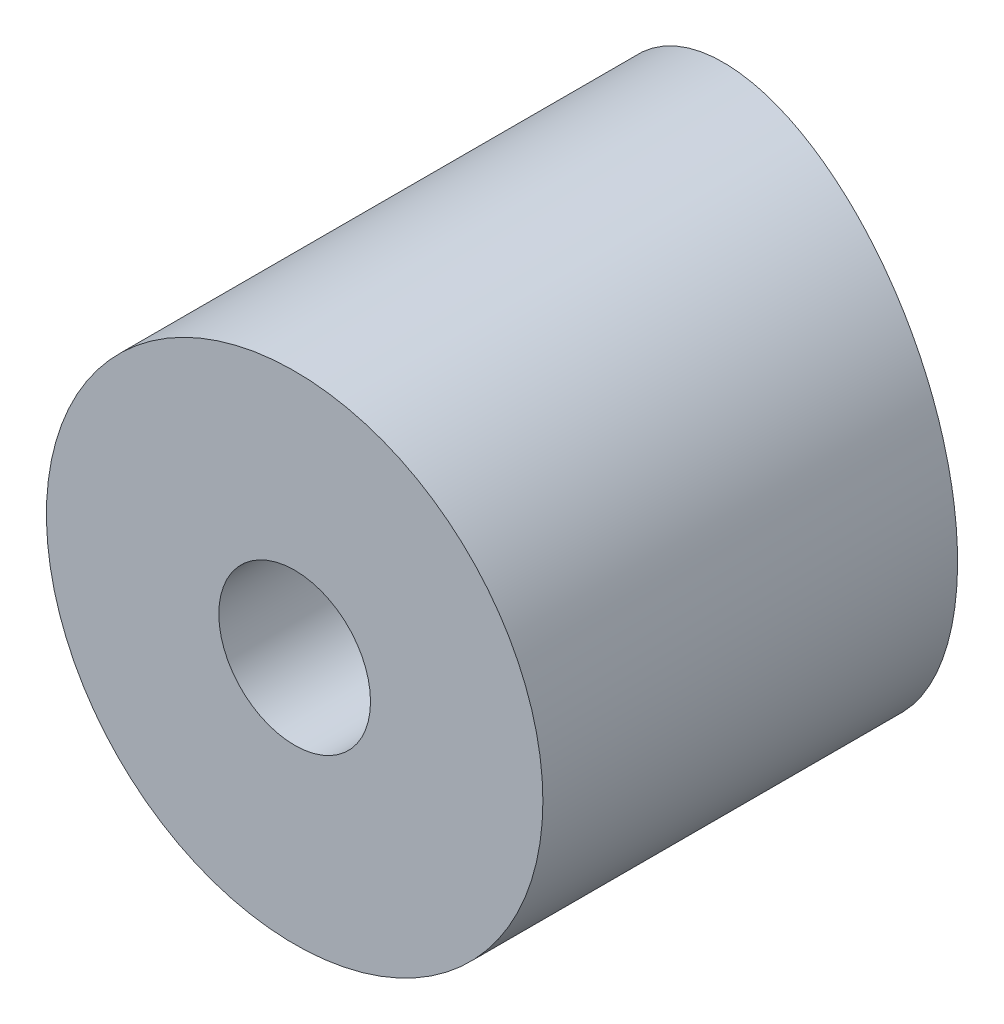
ISO-10303-21;
HEADER;
FILE_DESCRIPTION(('STEP AP214'),'2;1');
FILE_NAME('part.step','',(''),(''),'','','');
FILE_SCHEMA(('AUTOMOTIVE_DESIGN { 1 0 10303 214 1 1 1 1 }'));
ENDSEC;
DATA;
#1=APPLICATION_CONTEXT('core data for automotive mechanical design processes');
#2=APPLICATION_PROTOCOL_DEFINITION('international standard','automotive_design',2000,#1);
#3=PRODUCT_CONTEXT('',#1,'mechanical');
#4=PRODUCT('Part','Part','',(#3));
#5=PRODUCT_RELATED_PRODUCT_CATEGORY('part','',(#4));
#6=PRODUCT_DEFINITION_FORMATION('','',#4);
#7=PRODUCT_DEFINITION_CONTEXT('part definition',#1,'design');
#8=PRODUCT_DEFINITION('design','',#6,#7);
#9=PRODUCT_DEFINITION_SHAPE('','',#8);
#10=(LENGTH_UNIT() NAMED_UNIT(*) SI_UNIT(.MILLI.,.METRE.));
#11=(NAMED_UNIT(*) PLANE_ANGLE_UNIT() SI_UNIT($,.RADIAN.));
#12=(NAMED_UNIT(*) SI_UNIT($,.STERADIAN.) SOLID_ANGLE_UNIT());
#13=UNCERTAINTY_MEASURE_WITH_UNIT(LENGTH_MEASURE(1.E-05),#10,'distance_accuracy_value','');
#14=(GEOMETRIC_REPRESENTATION_CONTEXT(3) GLOBAL_UNCERTAINTY_ASSIGNED_CONTEXT((#13)) GLOBAL_UNIT_ASSIGNED_CONTEXT((#10,
#11,#12)) REPRESENTATION_CONTEXT('',''));
#15=CARTESIAN_POINT('',(0.,0.,0.));
#16=DIRECTION('',(0.,0.,1.));
#17=DIRECTION('',(1.,0.,0.));
#18=AXIS2_PLACEMENT_3D('',#15,#16,#17);
#19=CARTESIAN_POINT('',(-3.,0.,18.98));
#20=DIRECTION('',(0.,0.,-1.));
#21=DIRECTION('',(-1.,0.,0.));
#22=AXIS2_PLACEMENT_3D('',#19,#20,#21);
#23=CYLINDRICAL_SURFACE('',#22,3.6);
#24=CARTESIAN_POINT('',(-3.,0.,18.98));
#25=DIRECTION('',(0.,0.,1.));
#26=DIRECTION('',(1.,0.,0.));
#27=AXIS2_PLACEMENT_3D('',#24,#25,#26);
#28=CIRCLE('',#27,3.6);
#29=CARTESIAN_POINT('',(0.6,0.,18.98));
#30=VERTEX_POINT('',#29);
#31=EDGE_CURVE('E10',#30,#30,#28,.T.);
#32=ORIENTED_EDGE('',*,*,#31,.F.);
#33=EDGE_LOOP('',(#32));
#34=FACE_BOUND('',#33,.T.);
#35=CARTESIAN_POINT('',(-5.55780465821328,-2.53330521856828,11.4531031624935));
#36=CARTESIAN_POINT('',(-5.69695245606627,-2.39280160896815,11.4166550596926));
#37=CARTESIAN_POINT('',(-5.82494012210577,-2.24036488110553,11.3829554318623));
#38=CARTESIAN_POINT('',(-6.05460894482298,-1.91546269410203,11.3222644791129));
#39=CARTESIAN_POINT('',(-6.15626823991793,-1.74298076161108,11.2952787297438));
#40=CARTESIAN_POINT('',(-6.32996583632865,-1.38252199874723,11.2490507366634));
#41=CARTESIAN_POINT('',(-6.40198016491658,-1.19453277510435,11.2298147601579));
#42=CARTESIAN_POINT('',(-6.51376450725995,-0.808583705310813,11.1999124781532));
#43=CARTESIAN_POINT('',(-6.5535429563045,-0.610626481935858,11.1892439307878));
#44=CARTESIAN_POINT('',(-6.59902561140684,-0.214466248939631,11.1770426895589));
#45=CARTESIAN_POINT('',(-6.60537664630469,-0.0163426959370849,11.1753365717093));
#46=CARTESIAN_POINT('',(-6.58552743734195,0.378141618199218,11.1806637636876));
#47=CARTESIAN_POINT('',(-6.55932863630176,0.574502457079334,11.1876966861443));
#48=CARTESIAN_POINT('',(-6.47568248751485,0.958018899126808,11.2101037988848));
#49=CARTESIAN_POINT('',(-6.41852737833031,1.1452430158731,11.225399977647));
#50=CARTESIAN_POINT('',(-6.27505092605741,1.50730471860572,11.2636787142121));
#51=CARTESIAN_POINT('',(-6.18872824413432,1.68214173556012,11.286661624847));
#52=CARTESIAN_POINT('',(-5.98820627244466,2.01724843265321,11.3398358029851));
#53=CARTESIAN_POINT('',(-5.87362760421232,2.17727528249812,11.3701250364115));
#54=CARTESIAN_POINT('',(-5.62073812787668,2.47588979153145,11.4366549041422));
#55=CARTESIAN_POINT('',(-5.4824241089661,2.61447454530385,11.4728963436046));
#56=CARTESIAN_POINT('',(-5.18159000711541,2.87068776003733,11.5512959708702));
#57=CARTESIAN_POINT('',(-5.01847239171038,2.98757044661546,11.5935980633035));
#58=CARTESIAN_POINT('',(-4.67588412317759,3.19237534168253,11.6819109934411));
#59=CARTESIAN_POINT('',(-4.49641084495874,3.2802928907664,11.727922426359));
#60=CARTESIAN_POINT('',(-4.12029727022718,3.42737994823367,11.8237464007841));
#61=CARTESIAN_POINT('',(-3.92330029469351,3.48559063674736,11.8736320803596));
#62=CARTESIAN_POINT('',(-3.52254089671252,3.56774497499723,11.9744602067129));
#63=CARTESIAN_POINT('',(-3.3187776852896,3.59168461410636,12.0254027764673));
#64=CARTESIAN_POINT('',(-2.90641327057697,3.60479382258066,12.1278435752118));
#65=CARTESIAN_POINT('',(-2.69779034704657,3.59333933644855,12.1793356401055));
#66=CARTESIAN_POINT('',(-2.28522314172338,3.53447508566076,12.280538402377));
#67=CARTESIAN_POINT('',(-2.08127896553736,3.48706451024008,12.3302490595598));
#68=CARTESIAN_POINT('',(-1.6843273484798,3.35745775103404,12.4264535526943));
#69=CARTESIAN_POINT('',(-1.4913025091053,3.27531877986487,12.4729525337387));
#70=CARTESIAN_POINT('',(-1.12165631323758,3.07825911474722,12.5615455477209));
#71=CARTESIAN_POINT('',(-0.94503356075569,2.96334121402337,12.6036399555725));
#72=CARTESIAN_POINT('',(-0.616875563589728,2.70617065096016,12.6815076795885));
#73=CARTESIAN_POINT('',(-0.464932508066615,2.56447008360693,12.7173845925802));
#74=CARTESIAN_POINT('',(-0.187090043696,2.25622874735098,12.7827591219101));
#75=CARTESIAN_POINT('',(-0.0611866893926247,2.08969174817919,12.8122577047042));
#76=CARTESIAN_POINT('',(0.157388013223694,1.74128201361878,12.8633341334318));
#77=CARTESIAN_POINT('',(0.250857009555185,1.55993756430498,12.8851024598149));
#78=CARTESIAN_POINT('',(0.406012023158277,1.18343530248255,12.9211763979524));
#79=CARTESIAN_POINT('',(0.467702700337966,0.988279520016052,12.9354831038676));
#80=CARTESIAN_POINT('',(0.556148877208653,0.594607499896286,12.955979175456));
#81=CARTESIAN_POINT('',(0.583686676742371,0.396276209488391,12.9623503268379));
#82=CARTESIAN_POINT('',(0.605526196999485,-0.00229872604233351,12.9674039059409));
#83=CARTESIAN_POINT('',(0.599830683294245,-0.202542210653899,12.96608697344));
#84=CARTESIAN_POINT('',(0.555648891098547,-0.596905632569835,12.9558603861861));
#85=CARTESIAN_POINT('',(0.51752844303081,-0.791068927692747,12.9470354394664));
#86=CARTESIAN_POINT('',(0.410224181383061,-1.17011529999667,12.9221476084156));
#87=CARTESIAN_POINT('',(0.341040361201522,-1.35499837520546,12.9060847225463));
#88=CARTESIAN_POINT('',(0.173409197262859,-1.71126120792617,12.8670601125988));
#89=CARTESIAN_POINT('',(0.0748249187258867,-1.88257292310396,12.8440661007876));
#90=CARTESIAN_POINT('',(-0.148430373679417,-2.20617354714315,12.7918137280434));
#91=CARTESIAN_POINT('',(-0.273103426956234,-2.35846096735255,12.762554877372));
#92=CARTESIAN_POINT('',(-0.547370879395974,-2.6427915517607,12.6979225060122));
#93=CARTESIAN_POINT('',(-0.697385952342441,-2.77440514423757,12.6624453082844));
#94=CARTESIAN_POINT('',(-1.01624345715632,-3.01066418676797,12.5866744213922));
#95=CARTESIAN_POINT('',(-1.18508827577569,-3.11530621247941,12.5463801215924));
#96=CARTESIAN_POINT('',(-1.54145855425327,-3.29753484009677,12.4608796062651));
#97=CARTESIAN_POINT('',(-1.72935521954339,-3.37434841797012,12.4155730200453));
#98=CARTESIAN_POINT('',(-2.1147058764242,-3.49528966890568,12.3221080940868));
#99=CARTESIAN_POINT('',(-2.31216078719616,-3.5394141917027,12.2739494799793));
#100=CARTESIAN_POINT('',(-2.71601970268285,-3.59470029264702,12.1748426244235));
#101=CARTESIAN_POINT('',(-2.92252487523494,-3.60505442021984,12.1238552982138));
#102=CARTESIAN_POINT('',(-3.33425462789278,-3.59036525425029,12.0215427304604));
#103=CARTESIAN_POINT('',(-3.53947876318132,-3.56531028509593,11.9702173830144));
#104=CARTESIAN_POINT('',(-3.94535645252693,-3.47992008782585,11.8680622908581));
#105=CARTESIAN_POINT('',(-4.14592368274325,-3.4191581075157,11.8172462349028));
#106=CARTESIAN_POINT('',(-4.53390849305281,-3.26354341752956,11.7183356337986));
#107=CARTESIAN_POINT('',(-4.72134090097781,-3.1687299142749,11.6702380320727));
#108=CARTESIAN_POINT('',(-5.01851718345635,-2.98417425648098,11.5935434187938));
#109=CARTESIAN_POINT('',(-5.13344694395278,-2.90313355567719,11.5637596671524));
#110=CARTESIAN_POINT('',(-5.35341561169086,-2.72785786741542,11.5065513272989));
#111=CARTESIAN_POINT('',(-5.45845473817078,-2.63362317253405,11.4791266867954));
#112=CARTESIAN_POINT('',(-5.55780465821328,-2.53330521856828,11.4531031624935));
#113=B_SPLINE_CURVE_WITH_KNOTS('',3,(#35,#36,#37,#38,#39,#40,#41,#42,#43,#44,#45,#46,#47,#48,
#49,#50,#51,#52,#53,#54,#55,#56,#57,#58,#59,#60,#61,#62,#63,#64,#65,#66,#67,#68,#69,#70,#71,#72,
#73,#74,#75,#76,#77,#78,#79,#80,#81,#82,#83,#84,#85,#86,#87,#88,#89,#90,#91,#92,#93,#94,#95,#96,
#97,#98,#99,#100,#101,#102,#103,#104,#105,#106,#107,#108,#109,#110,#111,#112),.UNSPECIFIED.,.T.,
.F.,(4,2,2,2,2,2,2,2,2,2,2,2,2,2,2,2,2,2,2,2,2,2,2,2,2,2,2,2,2,2,2,2,2,2,2,2,2,2,4),(0.,
0.60272814100246,1.2059551601381,1.8096690316864,2.41322487599927,3.00505764446381,
3.59686417998716,4.18317882825377,4.76952039288706,5.36420961314089,5.9589793436797,
6.57143672161901,7.18399257294693,7.81523531631073,8.4465519258783,9.08906278328558,
9.73158812894284,10.3730590581104,11.0144753412779,11.6438819476309,12.2731931182428,
12.8856991000195,13.4981152395787,14.0962276679781,14.6942903240601,15.285693569178,
15.8770969399797,16.4712990163039,17.0655475598834,17.6708569973824,18.2762432478724,
18.8973480218829,19.5185126443749,20.1544244633249,20.7905460134703,21.4344293881107,
22.0775737692502,22.5079242398949,22.9382651690358),.UNSPECIFIED.);
#114=CARTESIAN_POINT('',(-5.55780465821328,-2.53330521856828,11.4531031624935));
#115=VERTEX_POINT('',#114);
#116=EDGE_CURVE('E49',#115,#115,#113,.T.);
#117=ORIENTED_EDGE('',*,*,#116,.F.);
#118=EDGE_LOOP('',(#117));
#119=FACE_BOUND('',#118,.T.);
#120=ADVANCED_FACE('F33',(#34,#119),#23,.T.);
#121=CARTESIAN_POINT('',(-3.,0.,18.98));
#122=DIRECTION('',(0.,0.,-1.));
#123=DIRECTION('',(-1.,0.,0.));
#124=AXIS2_PLACEMENT_3D('',#121,#122,#123);
#125=CYLINDRICAL_SURFACE('',#124,1.1);
#126=CARTESIAN_POINT('',(-3.,0.,18.98));
#127=DIRECTION('',(0.,0.,1.));
#128=DIRECTION('',(1.,0.,0.));
#129=AXIS2_PLACEMENT_3D('',#126,#127,#128);
#130=CIRCLE('',#129,1.1);
#131=CARTESIAN_POINT('',(-1.9,0.,18.98));
#132=VERTEX_POINT('',#131);
#133=EDGE_CURVE('E45',#132,#132,#130,.T.);
#134=ORIENTED_EDGE('',*,*,#133,.T.);
#135=EDGE_LOOP('',(#134));
#136=FACE_BOUND('',#135,.T.);
#137=CARTESIAN_POINT('',(-3.89947289119737,-0.633204957340862,12.3642048936766));
#138=CARTESIAN_POINT('',(-3.93412565255168,-0.583976339474155,12.3557968975943));
#139=CARTESIAN_POINT('',(-3.96482591323621,-0.531757274823448,12.3483393595079));
#140=CARTESIAN_POINT('',(-4.01733089756437,-0.422734414466465,12.3355768269858));
#141=CARTESIAN_POINT('',(-4.03912767755592,-0.365926578554756,12.3302737547792));
#142=CARTESIAN_POINT('',(-4.07309444572205,-0.249311343976059,12.3220067588114));
#143=CARTESIAN_POINT('',(-4.0852613641267,-0.189502995272839,12.3190435809532));
#144=CARTESIAN_POINT('',(-4.0995411875822,-0.0686400080430471,12.3155655976657));
#145=CARTESIAN_POINT('',(-4.10165633966613,-0.00758565112188134,12.3150502450346));
#146=CARTESIAN_POINT('',(-4.09580001411075,0.113349506309026,12.316476783472));
#147=CARTESIAN_POINT('',(-4.08793633897183,0.173235872191262,12.3183924123559));
#148=CARTESIAN_POINT('',(-4.06256780623281,0.290802834670761,12.3245690628306));
#149=CARTESIAN_POINT('',(-4.04506279129956,0.34848339525595,12.3288301226956));
#150=CARTESIAN_POINT('',(-4.00093444822562,0.460154540757818,12.3395632811118));
#151=CARTESIAN_POINT('',(-3.97429277795608,0.514137438921058,12.346039827256));
#152=CARTESIAN_POINT('',(-3.91273415338265,0.616848573610974,12.3609890679586));
#153=CARTESIAN_POINT('',(-3.87781656762804,0.665576408764393,12.3694619148339));
#154=CARTESIAN_POINT('',(-3.80001718516844,0.757404674968288,12.3883165595794));
#155=CARTESIAN_POINT('',(-3.75699709473149,0.800381068658702,12.3987314681529));
#156=CARTESIAN_POINT('',(-3.66471066706521,0.878531388978214,12.4210410300509));
#157=CARTESIAN_POINT('',(-3.61544351229865,0.913704292725096,12.4329358770474));
#158=CARTESIAN_POINT('',(-3.51062584644193,0.976261435575422,12.4582024616546));
#159=CARTESIAN_POINT('',(-3.45494080692505,1.00340760958316,12.471605586745));
#160=CARTESIAN_POINT('',(-3.33998965452186,1.0479542701983,12.4992260867495));
#161=CARTESIAN_POINT('',(-3.28072305877713,1.06535343947155,12.5134435714403));
#162=CARTESIAN_POINT('',(-3.15878221493692,1.0902989467625,12.5426442481831));
#163=CARTESIAN_POINT('',(-3.09606047756771,1.09760168894599,12.5576376043404));
#164=CARTESIAN_POINT('',(-2.97029341231647,1.1013974382504,12.587647308043));
#165=CARTESIAN_POINT('',(-2.90724805857352,1.09788956760984,12.6026636573564));
#166=CARTESIAN_POINT('',(-2.78195843582627,1.08004702217638,12.632453185844));
#167=CARTESIAN_POINT('',(-2.71972866450741,1.0656034817077,12.6472223836433));
#168=CARTESIAN_POINT('',(-2.5985294147207,1.02610107522048,12.6759390116852));
#169=CARTESIAN_POINT('',(-2.53955988962329,1.00104236106951,12.6898864536812));
#170=CARTESIAN_POINT('',(-2.42708819185822,0.941168767331005,12.7164478554953));
#171=CARTESIAN_POINT('',(-2.37354666130147,0.906432181055834,12.7290714415924));
#172=CARTESIAN_POINT('',(-2.27305989575066,0.828020524813843,12.7527322881668));
#173=CARTESIAN_POINT('',(-2.2261139145068,0.784346467448118,12.7637697281111));
#174=CARTESIAN_POINT('',(-2.14129065143718,0.690317611093661,12.7836909137147));
#175=CARTESIAN_POINT('',(-2.10323535842453,0.640132430404926,12.792616989515));
#176=CARTESIAN_POINT('',(-2.03612918764374,0.533765226175726,12.8083444271166));
#177=CARTESIAN_POINT('',(-2.00707688595092,0.477584152844957,12.8151461249137));
#178=CARTESIAN_POINT('',(-1.95960059418905,0.36241719191088,12.8262553627515));
#179=CARTESIAN_POINT('',(-1.94091646044296,0.303544383364423,12.8306239621593));
#180=CARTESIAN_POINT('',(-1.91364607101263,0.183382786639644,12.8369986319146));
#181=CARTESIAN_POINT('',(-1.90505854510254,0.122094303373472,12.8390049994479));
#182=CARTESIAN_POINT('',(-1.89833623376582,8.10991538785906E-05,12.8405756562887));
#183=CARTESIAN_POINT('',(-1.90000716500222,-0.060632419660058,12.8401853360737));
#184=CARTESIAN_POINT('',(-1.91329147450117,-0.180898447999981,12.837081191617));
#185=CARTESIAN_POINT('',(-1.9249044268233,-0.240451007152521,12.8343674669156));
#186=CARTESIAN_POINT('',(-1.957632862693,-0.356501011444163,12.8267149834998));
#187=CARTESIAN_POINT('',(-1.9787145278605,-0.413008534708952,12.8217841433486));
#188=CARTESIAN_POINT('',(-2.02970046438406,-0.521651380413234,12.8098490488473));
#189=CARTESIAN_POINT('',(-2.05960512739259,-0.573786508630345,12.8028447024543));
#190=CARTESIAN_POINT('',(-2.12775784202359,-0.672948260033726,12.7868650335295));
#191=CARTESIAN_POINT('',(-2.16610809201647,-0.719900695142546,12.7778655585556));
#192=CARTESIAN_POINT('',(-2.24977081028796,-0.80671659419475,12.7582080076215));
#193=CARTESIAN_POINT('',(-2.29508405417604,-0.846579267339439,12.7475497468871));
#194=CARTESIAN_POINT('',(-2.39252897448907,-0.919105433664395,12.724596682444));
#195=CARTESIAN_POINT('',(-2.44479742124103,-0.951574696382674,12.7122689277933));
#196=CARTESIAN_POINT('',(-2.55378809203825,-1.00729462701689,12.6865218671213));
#197=CARTESIAN_POINT('',(-2.61051091791877,-1.03054404665513,12.6731024135907));
#198=CARTESIAN_POINT('',(-2.72833749346486,-1.06776025292931,12.6451798973037));
#199=CARTESIAN_POINT('',(-2.78951582099253,-1.08147697308444,12.6306579959809));
#200=CARTESIAN_POINT('',(-2.91322349106299,-1.09834780967426,12.6012410261119));
#201=CARTESIAN_POINT('',(-2.97575292941323,-1.10150117456985,12.5863459310905));
#202=CARTESIAN_POINT('',(-3.10146779226747,-1.09714340175374,12.5563458777739));
#203=CARTESIAN_POINT('',(-3.16464738491803,-1.08945829016643,12.5412414384416));
#204=CARTESIAN_POINT('',(-3.2888645142489,-1.06329040796471,12.5114920892624));
#205=CARTESIAN_POINT('',(-3.34990145925716,-1.04480467934171,12.4968473064617));
#206=CARTESIAN_POINT('',(-3.46806384452989,-0.99748148154263,12.468448933613));
#207=CARTESIAN_POINT('',(-3.52518819101346,-0.968641131646145,12.4546955928281));
#208=CARTESIAN_POINT('',(-3.63374349130004,-0.901352818946355,12.4285200324208));
#209=CARTESIAN_POINT('',(-3.68518156016395,-0.862917063480361,12.4160961499267));
#210=CARTESIAN_POINT('',(-3.76406170906508,-0.792434894176383,12.3970192661029));
#211=CARTESIAN_POINT('',(-3.79361103690748,-0.762843792082492,12.3898659908959));
#212=CARTESIAN_POINT('',(-3.84923808848616,-0.700387820210085,12.3763894891056));
#213=CARTESIAN_POINT('',(-3.87531589016361,-0.66752302396007,12.3700662438869));
#214=CARTESIAN_POINT('',(-3.89947289119737,-0.633204957340862,12.3642048936766));
#215=B_SPLINE_CURVE_WITH_KNOTS('',3,(#137,#138,#139,#140,#141,#142,#143,#144,#145,#146,#147,
#148,#149,#150,#151,#152,#153,#154,#155,#156,#157,#158,#159,#160,#161,#162,#163,#164,#165,#166,
#167,#168,#169,#170,#171,#172,#173,#174,#175,#176,#177,#178,#179,#180,#181,#182,#183,#184,#185,
#186,#187,#188,#189,#190,#191,#192,#193,#194,#195,#196,#197,#198,#199,#200,#201,#202,#203,#204,
#205,#206,#207,#208,#209,#210,#211,#212,#213,#214),.UNSPECIFIED.,.T.,.F.,(4,2,2,2,2,2,2,2,2,2,2,
2,2,2,2,2,2,2,2,2,2,2,2,2,2,2,2,2,2,2,2,2,2,2,2,2,2,2,4),(0.,0.182208409216953,
0.364579030872653,0.54700776453948,0.72939571505672,0.909829976160719,1.09026718178585,
1.27106876214815,1.45188414207876,1.63612354836188,1.82038709051447,2.00966623009108,
2.1989709450891,2.39276769170894,2.58658017395866,2.78234787010897,2.97811276557414,
3.17233775830092,3.36654075781964,3.55643737381388,3.74630394016802,3.93116210954144,
4.11599701993861,4.29734230821501,4.47867982760593,4.6593747709907,4.84007773662288,
5.02310091666479,5.20614449849829,5.39355075784423,5.58098238153189,5.77316201292076,
5.96535531680608,6.16066895978707,6.35603611919455,6.55145767313804,6.74663186628471,
6.87365515099975,7.00067558336327),.UNSPECIFIED.);
#216=CARTESIAN_POINT('',(-3.89947289119737,-0.633204957340862,12.3642048936766));
#217=VERTEX_POINT('',#216);
#218=EDGE_CURVE('E37',#217,#217,#215,.T.);
#219=ORIENTED_EDGE('',*,*,#218,.T.);
#220=EDGE_LOOP('',(#219));
#221=FACE_BOUND('',#220,.T.);
#222=ADVANCED_FACE('F60',(#136,#221),#125,.F.);
#223=CARTESIAN_POINT('',(-3.,0.,18.98));
#224=DIRECTION('',(0.,0.,1.));
#225=DIRECTION('',(1.,0.,0.));
#226=AXIS2_PLACEMENT_3D('',#223,#224,#225);
#227=PLANE('',#226);
#228=ORIENTED_EDGE('',*,*,#31,.T.);
#229=EDGE_LOOP('',(#228));
#230=FACE_BOUND('',#229,.T.);
#231=ORIENTED_EDGE('',*,*,#133,.F.);
#232=EDGE_LOOP('',(#231));
#233=FACE_BOUND('',#232,.T.);
#234=ADVANCED_FACE('F58',(#230,#233),#227,.T.);
#235=CARTESIAN_POINT('',(0.,0.,0.));
#236=DIRECTION('',(0.,1.,0.));
#237=DIRECTION('',(1.,0.,0.));
#238=AXIS2_PLACEMENT_3D('',#235,#236,#237);
#239=SPHERICAL_SURFACE('',#238,12.98);
#240=ORIENTED_EDGE('',*,*,#218,.F.);
#241=EDGE_LOOP('',(#240));
#242=FACE_BOUND('',#241,.T.);
#243=ORIENTED_EDGE('',*,*,#116,.T.);
#244=EDGE_LOOP('',(#243));
#245=FACE_BOUND('',#244,.T.);
#246=ADVANCED_FACE('F55',(#242,#245),#239,.F.);
#247=CLOSED_SHELL('',(#120,#222,#234,#246));
#248=MANIFOLD_SOLID_BREP('B2',#247);
#249=ADVANCED_BREP_SHAPE_REPRESENTATION('',(#18,#248),#14);
#250=SHAPE_DEFINITION_REPRESENTATION(#9,#249);
ENDSEC;
END-ISO-10303-21;
